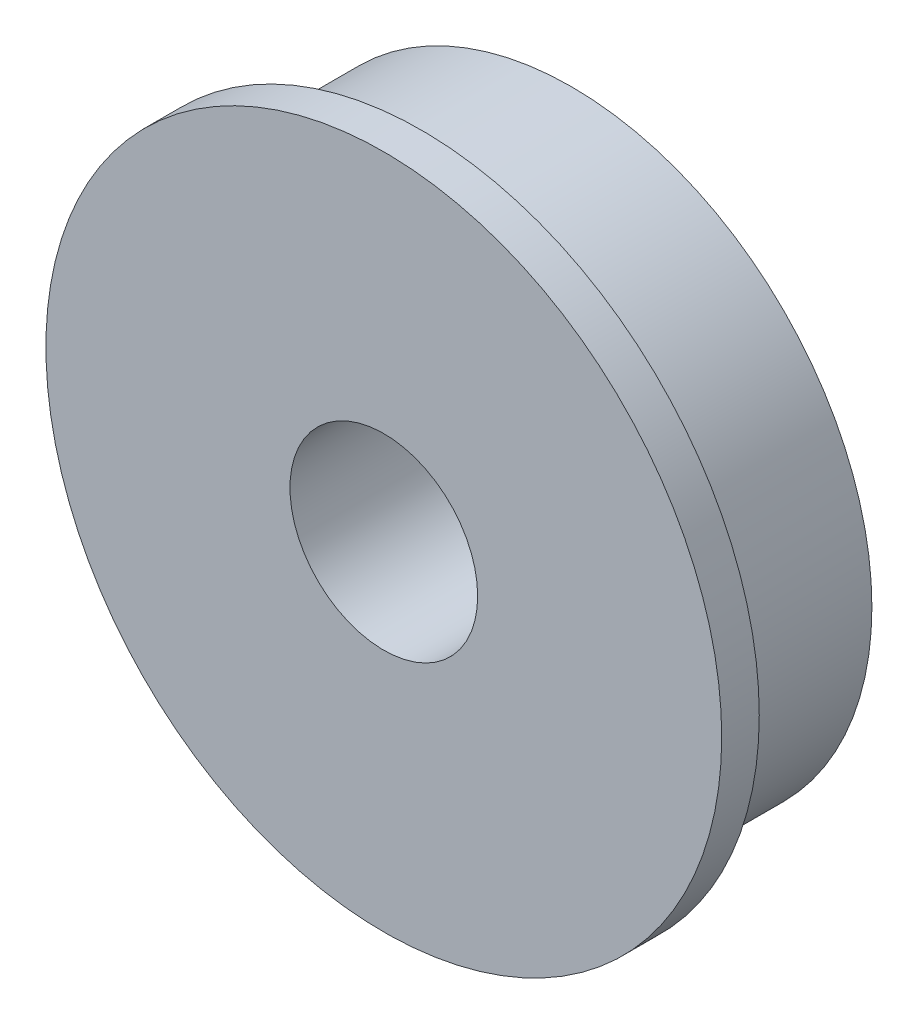
ISO-10303-21;
HEADER;
FILE_DESCRIPTION(('STEP AP214'),'2;1');
FILE_NAME('part.step','',(''),(''),'','','');
FILE_SCHEMA(('AUTOMOTIVE_DESIGN { 1 0 10303 214 1 1 1 1 }'));
ENDSEC;
DATA;
#1=APPLICATION_CONTEXT('core data for automotive mechanical design processes');
#2=APPLICATION_PROTOCOL_DEFINITION('international standard','automotive_design',2000,#1);
#3=PRODUCT_CONTEXT('',#1,'mechanical');
#4=PRODUCT('Part','Part','',(#3));
#5=PRODUCT_RELATED_PRODUCT_CATEGORY('part','',(#4));
#6=PRODUCT_DEFINITION_FORMATION('','',#4);
#7=PRODUCT_DEFINITION_CONTEXT('part definition',#1,'design');
#8=PRODUCT_DEFINITION('design','',#6,#7);
#9=PRODUCT_DEFINITION_SHAPE('','',#8);
#10=(LENGTH_UNIT() NAMED_UNIT(*) SI_UNIT(.MILLI.,.METRE.));
#11=(NAMED_UNIT(*) PLANE_ANGLE_UNIT() SI_UNIT($,.RADIAN.));
#12=(NAMED_UNIT(*) SI_UNIT($,.STERADIAN.) SOLID_ANGLE_UNIT());
#13=UNCERTAINTY_MEASURE_WITH_UNIT(LENGTH_MEASURE(1.E-05),#10,'distance_accuracy_value','');
#14=(GEOMETRIC_REPRESENTATION_CONTEXT(3) GLOBAL_UNCERTAINTY_ASSIGNED_CONTEXT((#13)) GLOBAL_UNIT_ASSIGNED_CONTEXT((#10,
#11,#12)) REPRESENTATION_CONTEXT('',''));
#15=CARTESIAN_POINT('',(0.,0.,0.));
#16=DIRECTION('',(0.,0.,1.));
#17=DIRECTION('',(1.,0.,0.));
#18=AXIS2_PLACEMENT_3D('',#15,#16,#17);
#19=CARTESIAN_POINT('',(0.,0.,0.));
#20=DIRECTION('',(0.,0.,1.));
#21=DIRECTION('',(1.,0.,0.));
#22=AXIS2_PLACEMENT_3D('',#19,#20,#21);
#23=PLANE('',#22);
#24=CARTESIAN_POINT('',(0.,0.,0.));
#25=DIRECTION('',(0.,0.,1.));
#26=DIRECTION('',(1.,0.,0.));
#27=AXIS2_PLACEMENT_3D('',#24,#25,#26);
#28=CIRCLE('',#27,8.);
#29=CARTESIAN_POINT('',(8.,0.,0.));
#30=VERTEX_POINT('',#29);
#31=EDGE_CURVE('E41',#30,#30,#28,.T.);
#32=ORIENTED_EDGE('',*,*,#31,.F.);
#33=EDGE_LOOP('',(#32));
#34=FACE_BOUND('',#33,.T.);
#35=CARTESIAN_POINT('',(0.,0.,0.));
#36=DIRECTION('',(0.,0.,1.));
#37=DIRECTION('',(1.,0.,0.));
#38=AXIS2_PLACEMENT_3D('',#35,#36,#37);
#39=CIRCLE('',#38,2.5);
#40=CARTESIAN_POINT('',(2.5,0.,0.));
#41=VERTEX_POINT('',#40);
#42=EDGE_CURVE('E48',#41,#41,#39,.T.);
#43=ORIENTED_EDGE('',*,*,#42,.T.);
#44=EDGE_LOOP('',(#43));
#45=FACE_BOUND('',#44,.T.);
#46=ADVANCED_FACE('F37',(#34,#45),#23,.F.);
#47=CARTESIAN_POINT('',(0.,0.,4.));
#48=DIRECTION('',(0.,0.,-1.));
#49=DIRECTION('',(-1.,0.,0.));
#50=AXIS2_PLACEMENT_3D('',#47,#48,#49);
#51=CYLINDRICAL_SURFACE('',#50,8.);
#52=CARTESIAN_POINT('',(0.,0.,4.));
#53=DIRECTION('',(0.,0.,1.));
#54=DIRECTION('',(1.,0.,0.));
#55=AXIS2_PLACEMENT_3D('',#52,#53,#54);
#56=CIRCLE('',#55,8.);
#57=CARTESIAN_POINT('',(8.,0.,4.));
#58=VERTEX_POINT('',#57);
#59=EDGE_CURVE('E10',#58,#58,#56,.T.);
#60=ORIENTED_EDGE('',*,*,#59,.F.);
#61=EDGE_LOOP('',(#60));
#62=FACE_BOUND('',#61,.T.);
#63=ORIENTED_EDGE('',*,*,#31,.T.);
#64=EDGE_LOOP('',(#63));
#65=FACE_BOUND('',#64,.T.);
#66=ADVANCED_FACE('F39',(#62,#65),#51,.T.);
#67=CARTESIAN_POINT('',(0.,0.,4.));
#68=DIRECTION('',(0.,0.,-1.));
#69=DIRECTION('',(-1.,0.,0.));
#70=AXIS2_PLACEMENT_3D('',#67,#68,#69);
#71=CYLINDRICAL_SURFACE('',#70,2.5);
#72=ORIENTED_EDGE('',*,*,#42,.F.);
#73=EDGE_LOOP('',(#72));
#74=FACE_BOUND('',#73,.T.);
#75=CARTESIAN_POINT('',(0.,0.,5.));
#76=DIRECTION('',(0.,0.,1.));
#77=DIRECTION('',(1.,0.,0.));
#78=AXIS2_PLACEMENT_3D('',#75,#76,#77);
#79=CIRCLE('',#78,2.5);
#80=CARTESIAN_POINT('',(2.5,0.,5.));
#81=VERTEX_POINT('',#80);
#82=EDGE_CURVE('E56',#81,#81,#79,.T.);
#83=ORIENTED_EDGE('',*,*,#82,.T.);
#84=EDGE_LOOP('',(#83));
#85=FACE_BOUND('',#84,.T.);
#86=ADVANCED_FACE('F62',(#74,#85),#71,.F.);
#87=CARTESIAN_POINT('',(0.,0.,5.));
#88=DIRECTION('',(0.,0.,1.));
#89=DIRECTION('',(1.,0.,0.));
#90=AXIS2_PLACEMENT_3D('',#87,#88,#89);
#91=PLANE('',#90);
#92=CARTESIAN_POINT('',(0.,0.,5.));
#93=DIRECTION('',(0.,0.,1.));
#94=DIRECTION('',(1.,0.,0.));
#95=AXIS2_PLACEMENT_3D('',#92,#93,#94);
#96=CIRCLE('',#95,9.);
#97=CARTESIAN_POINT('',(9.,0.,5.));
#98=VERTEX_POINT('',#97);
#99=EDGE_CURVE('E52',#98,#98,#96,.T.);
#100=ORIENTED_EDGE('',*,*,#99,.T.);
#101=EDGE_LOOP('',(#100));
#102=FACE_BOUND('',#101,.T.);
#103=ORIENTED_EDGE('',*,*,#82,.F.);
#104=EDGE_LOOP('',(#103));
#105=FACE_BOUND('',#104,.T.);
#106=ADVANCED_FACE('F64',(#102,#105),#91,.T.);
#107=CARTESIAN_POINT('',(0.,0.,4.));
#108=DIRECTION('',(0.,0.,1.));
#109=DIRECTION('',(1.,0.,0.));
#110=AXIS2_PLACEMENT_3D('',#107,#108,#109);
#111=PLANE('',#110);
#112=ORIENTED_EDGE('',*,*,#59,.T.);
#113=EDGE_LOOP('',(#112));
#114=FACE_BOUND('',#113,.T.);
#115=CARTESIAN_POINT('',(0.,0.,4.));
#116=DIRECTION('',(0.,0.,1.));
#117=DIRECTION('',(1.,0.,0.));
#118=AXIS2_PLACEMENT_3D('',#115,#116,#117);
#119=CIRCLE('',#118,9.);
#120=CARTESIAN_POINT('',(9.,0.,4.));
#121=VERTEX_POINT('',#120);
#122=EDGE_CURVE('E53',#121,#121,#119,.T.);
#123=ORIENTED_EDGE('',*,*,#122,.F.);
#124=EDGE_LOOP('',(#123));
#125=FACE_BOUND('',#124,.T.);
#126=ADVANCED_FACE('F66',(#114,#125),#111,.F.);
#127=CARTESIAN_POINT('',(0.,0.,5.));
#128=DIRECTION('',(0.,0.,-1.));
#129=DIRECTION('',(-1.,0.,0.));
#130=AXIS2_PLACEMENT_3D('',#127,#128,#129);
#131=CYLINDRICAL_SURFACE('',#130,9.);
#132=ORIENTED_EDGE('',*,*,#99,.F.);
#133=EDGE_LOOP('',(#132));
#134=FACE_BOUND('',#133,.T.);
#135=ORIENTED_EDGE('',*,*,#122,.T.);
#136=EDGE_LOOP('',(#135));
#137=FACE_BOUND('',#136,.T.);
#138=ADVANCED_FACE('F73',(#134,#137),#131,.T.);
#139=CLOSED_SHELL('',(#46,#66,#86,#106,#126,#138));
#140=MANIFOLD_SOLID_BREP('B2',#139);
#141=ADVANCED_BREP_SHAPE_REPRESENTATION('',(#18,#140),#14);
#142=SHAPE_DEFINITION_REPRESENTATION(#9,#141);
ENDSEC;
END-ISO-10303-21;
